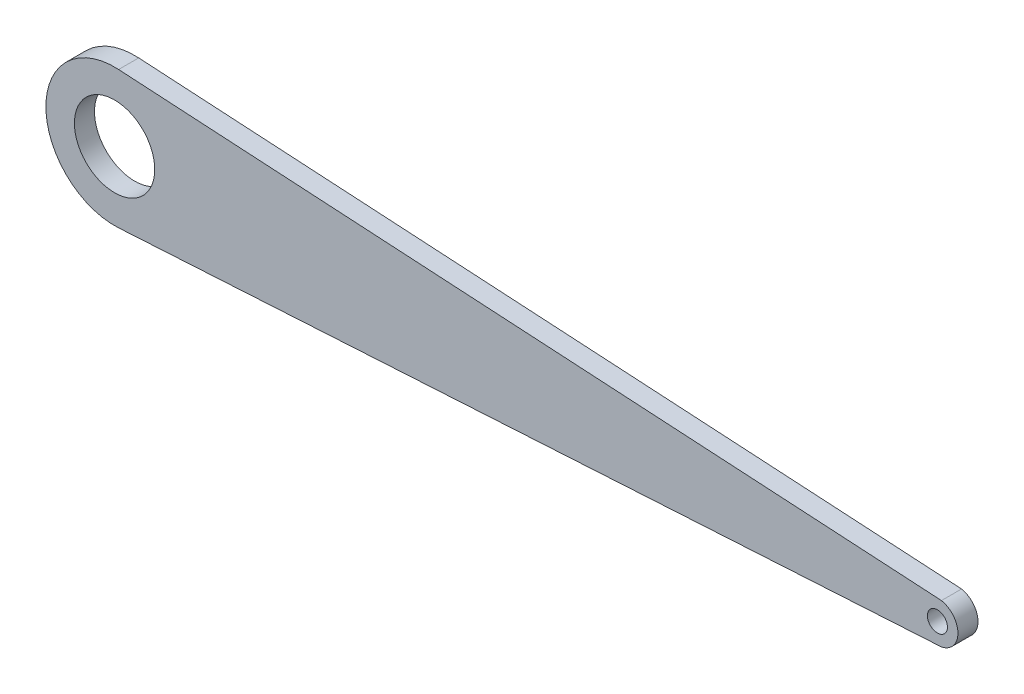
ISO-10303-21;
HEADER;
FILE_DESCRIPTION(('STEP AP214'),'2;1');
FILE_NAME('part.step','',(''),(''),'','','');
FILE_SCHEMA(('AUTOMOTIVE_DESIGN { 1 0 10303 214 1 1 1 1 }'));
ENDSEC;
DATA;
#1=APPLICATION_CONTEXT('core data for automotive mechanical design processes');
#2=APPLICATION_PROTOCOL_DEFINITION('international standard','automotive_design',2000,#1);
#3=PRODUCT_CONTEXT('',#1,'mechanical');
#4=PRODUCT('Part','Part','',(#3));
#5=PRODUCT_RELATED_PRODUCT_CATEGORY('part','',(#4));
#6=PRODUCT_DEFINITION_FORMATION('','',#4);
#7=PRODUCT_DEFINITION_CONTEXT('part definition',#1,'design');
#8=PRODUCT_DEFINITION('design','',#6,#7);
#9=PRODUCT_DEFINITION_SHAPE('','',#8);
#10=(LENGTH_UNIT() NAMED_UNIT(*) SI_UNIT(.MILLI.,.METRE.));
#11=(NAMED_UNIT(*) PLANE_ANGLE_UNIT() SI_UNIT($,.RADIAN.));
#12=(NAMED_UNIT(*) SI_UNIT($,.STERADIAN.) SOLID_ANGLE_UNIT());
#13=UNCERTAINTY_MEASURE_WITH_UNIT(LENGTH_MEASURE(1.E-05),#10,'distance_accuracy_value','');
#14=(GEOMETRIC_REPRESENTATION_CONTEXT(3) GLOBAL_UNCERTAINTY_ASSIGNED_CONTEXT((#13)) GLOBAL_UNIT_ASSIGNED_CONTEXT((#10,
#11,#12)) REPRESENTATION_CONTEXT('',''));
#15=CARTESIAN_POINT('',(0.,0.,0.));
#16=DIRECTION('',(0.,0.,1.));
#17=DIRECTION('',(1.,0.,0.));
#18=AXIS2_PLACEMENT_3D('',#15,#16,#17);
#19=CARTESIAN_POINT('',(101.393952941924,0.,5.));
#20=DIRECTION('',(0.,0.,-1.));
#21=DIRECTION('',(-1.,0.,0.));
#22=AXIS2_PLACEMENT_3D('',#19,#20,#21);
#23=PLANE('',#22);
#24=CARTESIAN_POINT('',(101.393952941924,0.,5.));
#25=DIRECTION('',(0.,0.,1.));
#26=DIRECTION('',(-1.,0.,0.));
#27=AXIS2_PLACEMENT_3D('',#24,#25,#26);
#28=CIRCLE('',#27,5.10020888621858);
#29=CARTESIAN_POINT('',(102.4,-5.,5.));
#30=VERTEX_POINT('',#29);
#31=CARTESIAN_POINT('',(102.4,5.,5.));
#32=VERTEX_POINT('',#31);
#33=EDGE_CURVE('E91',#30,#32,#28,.T.);
#34=ORIENTED_EDGE('',*,*,#33,.T.);
#35=DIRECTION('',(-0.998267777035382,0.0588340490943524,0.));
#36=VECTOR('',#35,1.);
#37=CARTESIAN_POINT('',(-102.4,17.0701213959912,5.));
#38=LINE('',#37,#36);
#39=CARTESIAN_POINT('',(-102.4,17.0701213959912,5.));
#40=VERTEX_POINT('',#39);
#41=EDGE_CURVE('E86',#32,#40,#38,.T.);
#42=ORIENTED_EDGE('',*,*,#41,.T.);
#43=CARTESIAN_POINT('',(-103.406047058076,0.,5.));
#44=DIRECTION('',(0.,0.,1.));
#45=DIRECTION('',(-1.,0.,0.));
#46=AXIS2_PLACEMENT_3D('',#43,#44,#45);
#47=CIRCLE('',#46,17.0997419617063);
#48=CARTESIAN_POINT('',(-102.4,-17.0701213959912,5.));
#49=VERTEX_POINT('',#48);
#50=EDGE_CURVE('E89',#40,#49,#47,.T.);
#51=ORIENTED_EDGE('',*,*,#50,.T.);
#52=DIRECTION('',(0.998267777035382,0.0588340490943524,0.));
#53=VECTOR('',#52,1.);
#54=CARTESIAN_POINT('',(-102.4,-17.0701213959912,5.));
#55=LINE('',#54,#53);
#56=EDGE_CURVE('E56',#49,#30,#55,.T.);
#57=ORIENTED_EDGE('',*,*,#56,.T.);
#58=EDGE_LOOP('',(#34,#42,#51,#57));
#59=FACE_BOUND('',#58,.T.);
#60=CARTESIAN_POINT('',(-103.406047058076,0.,5.));
#61=DIRECTION('',(0.,0.,1.));
#62=DIRECTION('',(1.,0.,0.));
#63=AXIS2_PLACEMENT_3D('',#60,#61,#62);
#64=CIRCLE('',#63,9.99999999999999);
#65=CARTESIAN_POINT('',(-93.4060470580758,0.,5.));
#66=VERTEX_POINT('',#65);
#67=EDGE_CURVE('E106',#66,#66,#64,.T.);
#68=ORIENTED_EDGE('',*,*,#67,.F.);
#69=EDGE_LOOP('',(#68));
#70=FACE_BOUND('',#69,.T.);
#71=CARTESIAN_POINT('',(101.393952941924,0.,5.));
#72=DIRECTION('',(0.,0.,1.));
#73=DIRECTION('',(1.,0.,0.));
#74=AXIS2_PLACEMENT_3D('',#71,#72,#73);
#75=CIRCLE('',#74,2.5);
#76=CARTESIAN_POINT('',(103.893952941924,0.,5.));
#77=VERTEX_POINT('',#76);
#78=EDGE_CURVE('E121',#77,#77,#75,.T.);
#79=ORIENTED_EDGE('',*,*,#78,.F.);
#80=EDGE_LOOP('',(#79));
#81=FACE_BOUND('',#80,.T.);
#82=ADVANCED_FACE('F39',(#59,#70,#81),#23,.F.);
#83=CARTESIAN_POINT('',(101.393952941924,0.,0.));
#84=DIRECTION('',(0.,0.,-1.));
#85=DIRECTION('',(-1.,0.,0.));
#86=AXIS2_PLACEMENT_3D('',#83,#84,#85);
#87=PLANE('',#86);
#88=CARTESIAN_POINT('',(-103.406047058076,0.,0.));
#89=DIRECTION('',(0.,0.,1.));
#90=DIRECTION('',(1.,0.,0.));
#91=AXIS2_PLACEMENT_3D('',#88,#89,#90);
#92=CIRCLE('',#91,9.99999999999999);
#93=CARTESIAN_POINT('',(-93.4060470580758,0.,0.));
#94=VERTEX_POINT('',#93);
#95=EDGE_CURVE('E118',#94,#94,#92,.T.);
#96=ORIENTED_EDGE('',*,*,#95,.T.);
#97=EDGE_LOOP('',(#96));
#98=FACE_BOUND('',#97,.T.);
#99=CARTESIAN_POINT('',(101.393952941924,0.,0.));
#100=DIRECTION('',(0.,0.,1.));
#101=DIRECTION('',(-1.,0.,0.));
#102=AXIS2_PLACEMENT_3D('',#99,#100,#101);
#103=CIRCLE('',#102,5.10020888621858);
#104=CARTESIAN_POINT('',(102.4,-5.,0.));
#105=VERTEX_POINT('',#104);
#106=CARTESIAN_POINT('',(102.4,5.,0.));
#107=VERTEX_POINT('',#106);
#108=EDGE_CURVE('E103',#105,#107,#103,.T.);
#109=ORIENTED_EDGE('',*,*,#108,.F.);
#110=DIRECTION('',(0.998267777035382,0.0588340490943524,0.));
#111=VECTOR('',#110,1.);
#112=CARTESIAN_POINT('',(-102.4,-17.0701213959912,0.));
#113=LINE('',#112,#111);
#114=CARTESIAN_POINT('',(-102.4,-17.0701213959912,0.));
#115=VERTEX_POINT('',#114);
#116=EDGE_CURVE('E79',#115,#105,#113,.T.);
#117=ORIENTED_EDGE('',*,*,#116,.F.);
#118=CARTESIAN_POINT('',(-103.406047058076,0.,0.));
#119=DIRECTION('',(0.,0.,1.));
#120=DIRECTION('',(-1.,0.,0.));
#121=AXIS2_PLACEMENT_3D('',#118,#119,#120);
#122=CIRCLE('',#121,17.0997419617063);
#123=CARTESIAN_POINT('',(-102.4,17.0701213959912,0.));
#124=VERTEX_POINT('',#123);
#125=EDGE_CURVE('E73',#124,#115,#122,.T.);
#126=ORIENTED_EDGE('',*,*,#125,.F.);
#127=DIRECTION('',(-0.998267777035382,0.0588340490943524,0.));
#128=VECTOR('',#127,1.);
#129=CARTESIAN_POINT('',(-102.4,17.0701213959912,0.));
#130=LINE('',#129,#128);
#131=EDGE_CURVE('E95',#107,#124,#130,.T.);
#132=ORIENTED_EDGE('',*,*,#131,.F.);
#133=EDGE_LOOP('',(#109,#117,#126,#132));
#134=FACE_BOUND('',#133,.T.);
#135=CARTESIAN_POINT('',(101.393952941924,0.,0.));
#136=DIRECTION('',(0.,0.,1.));
#137=DIRECTION('',(1.,0.,0.));
#138=AXIS2_PLACEMENT_3D('',#135,#136,#137);
#139=CIRCLE('',#138,2.5);
#140=CARTESIAN_POINT('',(103.893952941924,0.,0.));
#141=VERTEX_POINT('',#140);
#142=EDGE_CURVE('E124',#141,#141,#139,.T.);
#143=ORIENTED_EDGE('',*,*,#142,.T.);
#144=EDGE_LOOP('',(#143));
#145=FACE_BOUND('',#144,.T.);
#146=ADVANCED_FACE('F114',(#98,#134,#145),#87,.T.);
#147=CARTESIAN_POINT('',(101.393952941924,0.,5.));
#148=DIRECTION('',(0.,0.,-1.));
#149=DIRECTION('',(-1.,0.,0.));
#150=AXIS2_PLACEMENT_3D('',#147,#148,#149);
#151=CYLINDRICAL_SURFACE('',#150,5.10020888621858);
#152=ORIENTED_EDGE('',*,*,#108,.T.);
#153=DIRECTION('',(0.,0.,-1.));
#154=VECTOR('',#153,1.);
#155=CARTESIAN_POINT('',(102.4,5.,5.));
#156=LINE('',#155,#154);
#157=EDGE_CURVE('E11',#32,#107,#156,.T.);
#158=ORIENTED_EDGE('',*,*,#157,.F.);
#159=ORIENTED_EDGE('',*,*,#33,.F.);
#160=DIRECTION('',(0.,0.,-1.));
#161=VECTOR('',#160,1.);
#162=CARTESIAN_POINT('',(102.4,-5.,5.));
#163=LINE('',#162,#161);
#164=EDGE_CURVE('E99',#30,#105,#163,.T.);
#165=ORIENTED_EDGE('',*,*,#164,.T.);
#166=EDGE_LOOP('',(#152,#158,#159,#165));
#167=FACE_BOUND('',#166,.T.);
#168=ADVANCED_FACE('F41',(#167),#151,.T.);
#169=CARTESIAN_POINT('',(-102.4,17.0701213959912,5.));
#170=DIRECTION('',(-0.0588340490943524,-0.998267777035382,0.));
#171=DIRECTION('',(0.998267777035382,-0.0588340490943524,0.));
#172=AXIS2_PLACEMENT_3D('',#169,#170,#171);
#173=PLANE('',#172);
#174=ORIENTED_EDGE('',*,*,#131,.T.);
#175=DIRECTION('',(0.,0.,-1.));
#176=VECTOR('',#175,1.);
#177=CARTESIAN_POINT('',(-102.4,17.0701213959912,5.));
#178=LINE('',#177,#176);
#179=EDGE_CURVE('E48',#40,#124,#178,.T.);
#180=ORIENTED_EDGE('',*,*,#179,.F.);
#181=ORIENTED_EDGE('',*,*,#41,.F.);
#182=ORIENTED_EDGE('',*,*,#157,.T.);
#183=EDGE_LOOP('',(#174,#180,#181,#182));
#184=FACE_BOUND('',#183,.T.);
#185=ADVANCED_FACE('F94',(#184),#173,.F.);
#186=CARTESIAN_POINT('',(-103.406047058076,0.,5.));
#187=DIRECTION('',(0.,0.,-1.));
#188=DIRECTION('',(-1.,0.,0.));
#189=AXIS2_PLACEMENT_3D('',#186,#187,#188);
#190=CYLINDRICAL_SURFACE('',#189,17.0997419617063);
#191=ORIENTED_EDGE('',*,*,#125,.T.);
#192=DIRECTION('',(0.,0.,-1.));
#193=VECTOR('',#192,1.);
#194=CARTESIAN_POINT('',(-102.4,-17.0701213959912,5.));
#195=LINE('',#194,#193);
#196=EDGE_CURVE('E96',#49,#115,#195,.T.);
#197=ORIENTED_EDGE('',*,*,#196,.F.);
#198=ORIENTED_EDGE('',*,*,#50,.F.);
#199=ORIENTED_EDGE('',*,*,#179,.T.);
#200=EDGE_LOOP('',(#191,#197,#198,#199));
#201=FACE_BOUND('',#200,.T.);
#202=ADVANCED_FACE('F97',(#201),#190,.T.);
#203=CARTESIAN_POINT('',(-102.4,-17.0701213959912,5.));
#204=DIRECTION('',(-0.0588340490943524,0.998267777035382,0.));
#205=DIRECTION('',(-0.998267777035382,-0.0588340490943524,0.));
#206=AXIS2_PLACEMENT_3D('',#203,#204,#205);
#207=PLANE('',#206);
#208=ORIENTED_EDGE('',*,*,#116,.T.);
#209=ORIENTED_EDGE('',*,*,#164,.F.);
#210=ORIENTED_EDGE('',*,*,#56,.F.);
#211=ORIENTED_EDGE('',*,*,#196,.T.);
#212=EDGE_LOOP('',(#208,#209,#210,#211));
#213=FACE_BOUND('',#212,.T.);
#214=ADVANCED_FACE('F111',(#213),#207,.F.);
#215=CARTESIAN_POINT('',(-103.406047058076,0.,5.));
#216=DIRECTION('',(0.,0.,-1.));
#217=DIRECTION('',(-1.,0.,0.));
#218=AXIS2_PLACEMENT_3D('',#215,#216,#217);
#219=CYLINDRICAL_SURFACE('',#218,9.99999999999999);
#220=ORIENTED_EDGE('',*,*,#67,.T.);
#221=EDGE_LOOP('',(#220));
#222=FACE_BOUND('',#221,.T.);
#223=ORIENTED_EDGE('',*,*,#95,.F.);
#224=EDGE_LOOP('',(#223));
#225=FACE_BOUND('',#224,.T.);
#226=ADVANCED_FACE('F141',(#222,#225),#219,.F.);
#227=CARTESIAN_POINT('',(101.393952941924,0.,5.));
#228=DIRECTION('',(0.,0.,-1.));
#229=DIRECTION('',(-1.,0.,0.));
#230=AXIS2_PLACEMENT_3D('',#227,#228,#229);
#231=CYLINDRICAL_SURFACE('',#230,2.5);
#232=ORIENTED_EDGE('',*,*,#78,.T.);
#233=EDGE_LOOP('',(#232));
#234=FACE_BOUND('',#233,.T.);
#235=ORIENTED_EDGE('',*,*,#142,.F.);
#236=EDGE_LOOP('',(#235));
#237=FACE_BOUND('',#236,.T.);
#238=ADVANCED_FACE('F130',(#234,#237),#231,.F.);
#239=CLOSED_SHELL('',(#82,#146,#168,#185,#202,#214,#226,#238));
#240=MANIFOLD_SOLID_BREP('B2',#239);
#241=ADVANCED_BREP_SHAPE_REPRESENTATION('',(#18,#240),#14);
#242=SHAPE_DEFINITION_REPRESENTATION(#9,#241);
ENDSEC;
END-ISO-10303-21;
